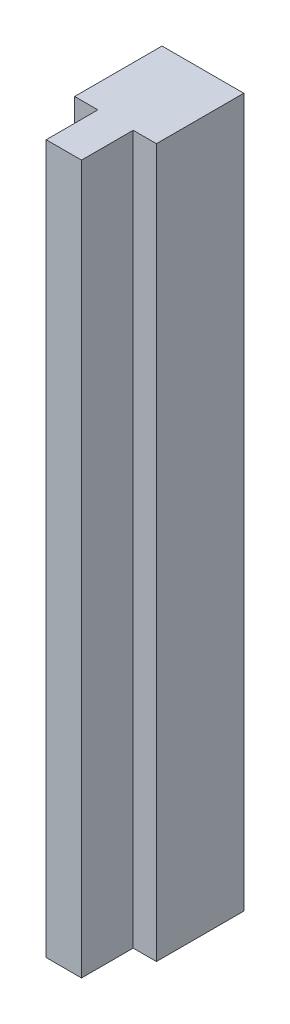
ISO-10303-21;
HEADER;
FILE_DESCRIPTION(('STEP AP214'),'2;1');
FILE_NAME('part.step','',(''),(''),'','','');
FILE_SCHEMA(('AUTOMOTIVE_DESIGN { 1 0 10303 214 1 1 1 1 }'));
ENDSEC;
DATA;
#1=APPLICATION_CONTEXT('core data for automotive mechanical design processes');
#2=APPLICATION_PROTOCOL_DEFINITION('international standard','automotive_design',2000,#1);
#3=PRODUCT_CONTEXT('',#1,'mechanical');
#4=PRODUCT('Part','Part','',(#3));
#5=PRODUCT_RELATED_PRODUCT_CATEGORY('part','',(#4));
#6=PRODUCT_DEFINITION_FORMATION('','',#4);
#7=PRODUCT_DEFINITION_CONTEXT('part definition',#1,'design');
#8=PRODUCT_DEFINITION('design','',#6,#7);
#9=PRODUCT_DEFINITION_SHAPE('','',#8);
#10=(LENGTH_UNIT() NAMED_UNIT(*) SI_UNIT(.MILLI.,.METRE.));
#11=(NAMED_UNIT(*) PLANE_ANGLE_UNIT() SI_UNIT($,.RADIAN.));
#12=(NAMED_UNIT(*) SI_UNIT($,.STERADIAN.) SOLID_ANGLE_UNIT());
#13=UNCERTAINTY_MEASURE_WITH_UNIT(LENGTH_MEASURE(1.E-05),#10,'distance_accuracy_value','');
#14=(GEOMETRIC_REPRESENTATION_CONTEXT(3) GLOBAL_UNCERTAINTY_ASSIGNED_CONTEXT((#13)) GLOBAL_UNIT_ASSIGNED_CONTEXT((#10,
#11,#12)) REPRESENTATION_CONTEXT('',''));
#15=CARTESIAN_POINT('',(0.,0.,0.));
#16=DIRECTION('',(0.,0.,1.));
#17=DIRECTION('',(1.,0.,0.));
#18=AXIS2_PLACEMENT_3D('',#15,#16,#17);
#19=CARTESIAN_POINT('',(1.00000000000331,38.1,2.5));
#20=DIRECTION('',(0.,0.,1.));
#21=DIRECTION('',(1.,0.,0.));
#22=AXIS2_PLACEMENT_3D('',#19,#20,#21);
#23=PLANE('',#22);
#24=DIRECTION('',(-1.,0.,0.));
#25=VECTOR('',#24,1.);
#26=CARTESIAN_POINT('',(1.00000000000331,0.,2.5));
#27=LINE('',#26,#25);
#28=CARTESIAN_POINT('',(-0.949999999996692,0.,2.49999999999996));
#29=VERTEX_POINT('',#28);
#30=CARTESIAN_POINT('',(-2.2,0.,2.5));
#31=VERTEX_POINT('',#30);
#32=EDGE_CURVE('E124',#29,#31,#27,.T.);
#33=ORIENTED_EDGE('',*,*,#32,.F.);
#34=DIRECTION('',(0.,-1.,0.));
#35=VECTOR('',#34,1.);
#36=CARTESIAN_POINT('',(-0.949999999996692,38.1,2.49999999999996));
#37=LINE('',#36,#35);
#38=CARTESIAN_POINT('',(-0.949999999996692,38.1,2.49999999999996));
#39=VERTEX_POINT('',#38);
#40=EDGE_CURVE('E150',#39,#29,#37,.T.);
#41=ORIENTED_EDGE('',*,*,#40,.F.);
#42=DIRECTION('',(-1.,0.,0.));
#43=VECTOR('',#42,1.);
#44=CARTESIAN_POINT('',(-2.2,38.1,2.5));
#45=LINE('',#44,#43);
#46=CARTESIAN_POINT('',(-2.2,38.1,2.5));
#47=VERTEX_POINT('',#46);
#48=EDGE_CURVE('E123',#39,#47,#45,.T.);
#49=ORIENTED_EDGE('',*,*,#48,.T.);
#50=DIRECTION('',(0.,-1.,0.));
#51=VECTOR('',#50,1.);
#52=CARTESIAN_POINT('',(-2.2,38.1,2.5));
#53=LINE('',#52,#51);
#54=EDGE_CURVE('E117',#47,#31,#53,.T.);
#55=ORIENTED_EDGE('',*,*,#54,.T.);
#56=EDGE_LOOP('',(#33,#41,#49,#55));
#57=FACE_BOUND('',#56,.T.);
#58=ADVANCED_FACE('F57',(#57),#23,.T.);
#59=CARTESIAN_POINT('',(0.,0.,0.));
#60=DIRECTION('',(0.,1.,0.));
#61=DIRECTION('',(0.,0.,1.));
#62=AXIS2_PLACEMENT_3D('',#59,#60,#61);
#63=PLANE('',#62);
#64=CARTESIAN_POINT('',(2.2,0.,2.5));
#65=VERTEX_POINT('',#64);
#66=CARTESIAN_POINT('',(0.950000000003308,0.,2.5));
#67=VERTEX_POINT('',#66);
#68=EDGE_CURVE('E106',#65,#67,#27,.T.);
#69=ORIENTED_EDGE('',*,*,#68,.T.);
#70=DIRECTION('',(0.,0.,-1.));
#71=VECTOR('',#70,1.);
#72=CARTESIAN_POINT('',(0.950000000003308,0.,2.5));
#73=LINE('',#72,#71);
#74=CARTESIAN_POINT('',(0.950000000003308,0.,5.2800000000001));
#75=VERTEX_POINT('',#74);
#76=EDGE_CURVE('E288',#75,#67,#73,.T.);
#77=ORIENTED_EDGE('',*,*,#76,.F.);
#78=DIRECTION('',(1.,0.,0.));
#79=VECTOR('',#78,1.);
#80=CARTESIAN_POINT('',(-0.999999999996692,0.,5.2800000000001));
#81=LINE('',#80,#79);
#82=CARTESIAN_POINT('',(-0.949999999996692,0.,5.2800000000001));
#83=VERTEX_POINT('',#82);
#84=EDGE_CURVE('E285',#83,#75,#81,.T.);
#85=ORIENTED_EDGE('',*,*,#84,.F.);
#86=DIRECTION('',(0.,0.,1.));
#87=VECTOR('',#86,1.);
#88=CARTESIAN_POINT('',(-0.949999999996692,0.,2.49999999999996));
#89=LINE('',#88,#87);
#90=EDGE_CURVE('E275',#29,#83,#89,.T.);
#91=ORIENTED_EDGE('',*,*,#90,.F.);
#92=ORIENTED_EDGE('',*,*,#32,.T.);
#93=DIRECTION('',(0.,0.,-1.));
#94=VECTOR('',#93,1.);
#95=CARTESIAN_POINT('',(-2.2,0.,2.2));
#96=LINE('',#95,#94);
#97=CARTESIAN_POINT('',(-2.2,0.,-2.2));
#98=VERTEX_POINT('',#97);
#99=EDGE_CURVE('E110',#31,#98,#96,.T.);
#100=ORIENTED_EDGE('',*,*,#99,.T.);
#101=DIRECTION('',(1.,0.,0.));
#102=VECTOR('',#101,1.);
#103=CARTESIAN_POINT('',(-2.2,0.,-2.2));
#104=LINE('',#103,#102);
#105=CARTESIAN_POINT('',(2.2,0.,-2.2));
#106=VERTEX_POINT('',#105);
#107=EDGE_CURVE('E109',#98,#106,#104,.T.);
#108=ORIENTED_EDGE('',*,*,#107,.T.);
#109=DIRECTION('',(0.,0.,1.));
#110=VECTOR('',#109,1.);
#111=CARTESIAN_POINT('',(2.2,0.,2.2));
#112=LINE('',#111,#110);
#113=EDGE_CURVE('E102',#106,#65,#112,.T.);
#114=ORIENTED_EDGE('',*,*,#113,.T.);
#115=EDGE_LOOP('',(#69,#77,#85,#91,#92,#100,#108,#114));
#116=FACE_BOUND('',#115,.T.);
#117=ADVANCED_FACE('F59',(#116),#63,.F.);
#118=CARTESIAN_POINT('',(2.2,38.1,2.2));
#119=DIRECTION('',(1.,0.,0.));
#120=DIRECTION('',(0.,0.,-1.));
#121=AXIS2_PLACEMENT_3D('',#118,#119,#120);
#122=PLANE('',#121);
#123=ORIENTED_EDGE('',*,*,#113,.F.);
#124=DIRECTION('',(0.,-1.,0.));
#125=VECTOR('',#124,1.);
#126=CARTESIAN_POINT('',(2.2,38.1,-2.2));
#127=LINE('',#126,#125);
#128=CARTESIAN_POINT('',(2.2,38.1,-2.2));
#129=VERTEX_POINT('',#128);
#130=EDGE_CURVE('E12',#129,#106,#127,.T.);
#131=ORIENTED_EDGE('',*,*,#130,.F.);
#132=DIRECTION('',(0.,0.,1.));
#133=VECTOR('',#132,1.);
#134=CARTESIAN_POINT('',(2.2,38.1,2.2));
#135=LINE('',#134,#133);
#136=CARTESIAN_POINT('',(2.2,38.1,2.5));
#137=VERTEX_POINT('',#136);
#138=EDGE_CURVE('E88',#129,#137,#135,.T.);
#139=ORIENTED_EDGE('',*,*,#138,.T.);
#140=DIRECTION('',(0.,-1.,0.));
#141=VECTOR('',#140,1.);
#142=CARTESIAN_POINT('',(2.2,38.1,2.5));
#143=LINE('',#142,#141);
#144=EDGE_CURVE('E111',#137,#65,#143,.T.);
#145=ORIENTED_EDGE('',*,*,#144,.T.);
#146=EDGE_LOOP('',(#123,#131,#139,#145));
#147=FACE_BOUND('',#146,.T.);
#148=ADVANCED_FACE('F114',(#147),#122,.T.);
#149=CARTESIAN_POINT('',(-2.2,38.1,-2.2));
#150=DIRECTION('',(0.,0.,-1.));
#151=DIRECTION('',(-1.,0.,0.));
#152=AXIS2_PLACEMENT_3D('',#149,#150,#151);
#153=PLANE('',#152);
#154=ORIENTED_EDGE('',*,*,#107,.F.);
#155=DIRECTION('',(0.,-1.,0.));
#156=VECTOR('',#155,1.);
#157=CARTESIAN_POINT('',(-2.2,38.1,-2.2));
#158=LINE('',#157,#156);
#159=CARTESIAN_POINT('',(-2.2,38.1,-2.2));
#160=VERTEX_POINT('',#159);
#161=EDGE_CURVE('E61',#160,#98,#158,.T.);
#162=ORIENTED_EDGE('',*,*,#161,.F.);
#163=DIRECTION('',(1.,0.,0.));
#164=VECTOR('',#163,1.);
#165=CARTESIAN_POINT('',(-2.2,38.1,-2.2));
#166=LINE('',#165,#164);
#167=EDGE_CURVE('E136',#160,#129,#166,.T.);
#168=ORIENTED_EDGE('',*,*,#167,.T.);
#169=ORIENTED_EDGE('',*,*,#130,.T.);
#170=EDGE_LOOP('',(#154,#162,#168,#169));
#171=FACE_BOUND('',#170,.T.);
#172=ADVANCED_FACE('F158',(#171),#153,.T.);
#173=CARTESIAN_POINT('',(-2.2,38.1,2.2));
#174=DIRECTION('',(-1.,0.,0.));
#175=DIRECTION('',(0.,0.,1.));
#176=AXIS2_PLACEMENT_3D('',#173,#174,#175);
#177=PLANE('',#176);
#178=ORIENTED_EDGE('',*,*,#99,.F.);
#179=ORIENTED_EDGE('',*,*,#54,.F.);
#180=DIRECTION('',(0.,0.,-1.));
#181=VECTOR('',#180,1.);
#182=CARTESIAN_POINT('',(-2.2,38.1,2.2));
#183=LINE('',#182,#181);
#184=EDGE_CURVE('E134',#47,#160,#183,.T.);
#185=ORIENTED_EDGE('',*,*,#184,.T.);
#186=ORIENTED_EDGE('',*,*,#161,.T.);
#187=EDGE_LOOP('',(#178,#179,#185,#186));
#188=FACE_BOUND('',#187,.T.);
#189=ADVANCED_FACE('F142',(#188),#177,.T.);
#190=CARTESIAN_POINT('',(0.,38.1,0.));
#191=DIRECTION('',(0.,1.,0.));
#192=DIRECTION('',(0.,0.,1.));
#193=AXIS2_PLACEMENT_3D('',#190,#191,#192);
#194=PLANE('',#193);
#195=DIRECTION('',(0.,0.,-1.));
#196=VECTOR('',#195,1.);
#197=CARTESIAN_POINT('',(0.950000000003308,38.1,2.5));
#198=LINE('',#197,#196);
#199=CARTESIAN_POINT('',(0.950000000003308,38.1,5.2800000000001));
#200=VERTEX_POINT('',#199);
#201=CARTESIAN_POINT('',(0.950000000003308,38.1,2.5));
#202=VERTEX_POINT('',#201);
#203=EDGE_CURVE('E296',#200,#202,#198,.T.);
#204=ORIENTED_EDGE('',*,*,#203,.T.);
#205=EDGE_CURVE('E126',#137,#202,#45,.T.);
#206=ORIENTED_EDGE('',*,*,#205,.F.);
#207=ORIENTED_EDGE('',*,*,#138,.F.);
#208=ORIENTED_EDGE('',*,*,#167,.F.);
#209=ORIENTED_EDGE('',*,*,#184,.F.);
#210=ORIENTED_EDGE('',*,*,#48,.F.);
#211=DIRECTION('',(0.,0.,1.));
#212=VECTOR('',#211,1.);
#213=CARTESIAN_POINT('',(-0.949999999996692,38.1,2.49999999999996));
#214=LINE('',#213,#212);
#215=CARTESIAN_POINT('',(-0.949999999996692,38.1,5.2800000000001));
#216=VERTEX_POINT('',#215);
#217=EDGE_CURVE('E279',#39,#216,#214,.T.);
#218=ORIENTED_EDGE('',*,*,#217,.T.);
#219=DIRECTION('',(1.,0.,0.));
#220=VECTOR('',#219,1.);
#221=CARTESIAN_POINT('',(-0.999999999996692,38.1,5.2800000000001));
#222=LINE('',#221,#220);
#223=EDGE_CURVE('E128',#216,#200,#222,.T.);
#224=ORIENTED_EDGE('',*,*,#223,.T.);
#225=EDGE_LOOP('',(#204,#206,#207,#208,#209,#210,#218,#224));
#226=FACE_BOUND('',#225,.T.);
#227=ADVANCED_FACE('F156',(#226),#194,.T.);
#228=ORIENTED_EDGE('',*,*,#205,.T.);
#229=DIRECTION('',(0.,-1.,0.));
#230=VECTOR('',#229,1.);
#231=CARTESIAN_POINT('',(0.950000000003308,38.1,2.5));
#232=LINE('',#231,#230);
#233=EDGE_CURVE('E121',#202,#67,#232,.T.);
#234=ORIENTED_EDGE('',*,*,#233,.T.);
#235=ORIENTED_EDGE('',*,*,#68,.F.);
#236=ORIENTED_EDGE('',*,*,#144,.F.);
#237=EDGE_LOOP('',(#228,#234,#235,#236));
#238=FACE_BOUND('',#237,.T.);
#239=ADVANCED_FACE('F119',(#238),#23,.T.);
#240=CARTESIAN_POINT('',(-0.999999999996692,0.,5.2800000000001));
#241=DIRECTION('',(0.,0.,1.));
#242=DIRECTION('',(1.,0.,0.));
#243=AXIS2_PLACEMENT_3D('',#240,#241,#242);
#244=PLANE('',#243);
#245=DIRECTION('',(0.,-1.,0.));
#246=VECTOR('',#245,1.);
#247=CARTESIAN_POINT('',(0.950000000003308,38.1,5.2800000000001));
#248=LINE('',#247,#246);
#249=EDGE_CURVE('E293',#200,#75,#248,.T.);
#250=ORIENTED_EDGE('',*,*,#249,.F.);
#251=ORIENTED_EDGE('',*,*,#223,.F.);
#252=DIRECTION('',(0.,-1.,0.));
#253=VECTOR('',#252,1.);
#254=CARTESIAN_POINT('',(-0.949999999996692,38.1,5.2800000000001));
#255=LINE('',#254,#253);
#256=EDGE_CURVE('E277',#216,#83,#255,.T.);
#257=ORIENTED_EDGE('',*,*,#256,.T.);
#258=ORIENTED_EDGE('',*,*,#84,.T.);
#259=EDGE_LOOP('',(#250,#251,#257,#258));
#260=FACE_BOUND('',#259,.T.);
#261=ADVANCED_FACE('F175',(#260),#244,.T.);
#262=CARTESIAN_POINT('',(-0.949999999996692,38.1,2.49999999999996));
#263=DIRECTION('',(1.,0.,0.));
#264=DIRECTION('',(0.,0.,-1.));
#265=AXIS2_PLACEMENT_3D('',#262,#263,#264);
#266=PLANE('',#265);
#267=ORIENTED_EDGE('',*,*,#90,.T.);
#268=ORIENTED_EDGE('',*,*,#256,.F.);
#269=ORIENTED_EDGE('',*,*,#217,.F.);
#270=ORIENTED_EDGE('',*,*,#40,.T.);
#271=EDGE_LOOP('',(#267,#268,#269,#270));
#272=FACE_BOUND('',#271,.T.);
#273=ADVANCED_FACE('F180',(#272),#266,.F.);
#274=CARTESIAN_POINT('',(0.950000000003308,38.1,2.5));
#275=DIRECTION('',(-1.,0.,0.));
#276=DIRECTION('',(0.,0.,1.));
#277=AXIS2_PLACEMENT_3D('',#274,#275,#276);
#278=PLANE('',#277);
#279=ORIENTED_EDGE('',*,*,#76,.T.);
#280=ORIENTED_EDGE('',*,*,#233,.F.);
#281=ORIENTED_EDGE('',*,*,#203,.F.);
#282=ORIENTED_EDGE('',*,*,#249,.T.);
#283=EDGE_LOOP('',(#279,#280,#281,#282));
#284=FACE_BOUND('',#283,.T.);
#285=ADVANCED_FACE('F201',(#284),#278,.F.);
#286=CLOSED_SHELL('',(#58,#117,#148,#172,#189,#227,#239,#261,#273,#285));
#287=MANIFOLD_SOLID_BREP('B2',#286);
#288=ADVANCED_BREP_SHAPE_REPRESENTATION('',(#18,#287),#14);
#289=SHAPE_DEFINITION_REPRESENTATION(#9,#288);
ENDSEC;
END-ISO-10303-21;
